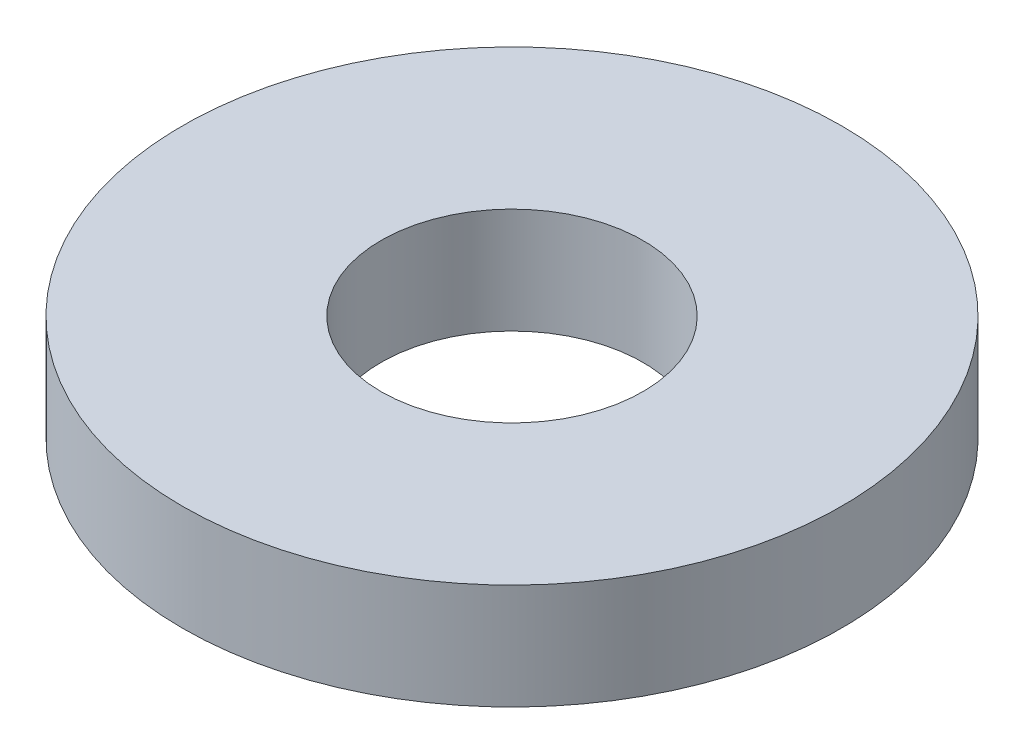
ISO-10303-21;
HEADER;
FILE_DESCRIPTION(('STEP AP214'),'2;1');
FILE_NAME('part.step','',(''),(''),'','','');
FILE_SCHEMA(('AUTOMOTIVE_DESIGN { 1 0 10303 214 1 1 1 1 }'));
ENDSEC;
DATA;
#1=APPLICATION_CONTEXT('core data for automotive mechanical design processes');
#2=APPLICATION_PROTOCOL_DEFINITION('international standard','automotive_design',2000,#1);
#3=PRODUCT_CONTEXT('',#1,'mechanical');
#4=PRODUCT('Part','Part','',(#3));
#5=PRODUCT_RELATED_PRODUCT_CATEGORY('part','',(#4));
#6=PRODUCT_DEFINITION_FORMATION('','',#4);
#7=PRODUCT_DEFINITION_CONTEXT('part definition',#1,'design');
#8=PRODUCT_DEFINITION('design','',#6,#7);
#9=PRODUCT_DEFINITION_SHAPE('','',#8);
#10=(LENGTH_UNIT() NAMED_UNIT(*) SI_UNIT(.MILLI.,.METRE.));
#11=(NAMED_UNIT(*) PLANE_ANGLE_UNIT() SI_UNIT($,.RADIAN.));
#12=(NAMED_UNIT(*) SI_UNIT($,.STERADIAN.) SOLID_ANGLE_UNIT());
#13=UNCERTAINTY_MEASURE_WITH_UNIT(LENGTH_MEASURE(1.E-05),#10,'distance_accuracy_value','');
#14=(GEOMETRIC_REPRESENTATION_CONTEXT(3) GLOBAL_UNCERTAINTY_ASSIGNED_CONTEXT((#13)) GLOBAL_UNIT_ASSIGNED_CONTEXT((#10,
#11,#12)) REPRESENTATION_CONTEXT('',''));
#15=CARTESIAN_POINT('',(0.,0.,0.));
#16=DIRECTION('',(0.,0.,1.));
#17=DIRECTION('',(1.,0.,0.));
#18=AXIS2_PLACEMENT_3D('',#15,#16,#17);
#19=CARTESIAN_POINT('',(0.,0.635,0.));
#20=DIRECTION('',(0.,1.,0.));
#21=DIRECTION('',(0.,0.,1.));
#22=AXIS2_PLACEMENT_3D('',#19,#20,#21);
#23=PLANE('',#22);
#24=CARTESIAN_POINT('',(0.,0.635,0.));
#25=DIRECTION('',(0.,1.,0.));
#26=DIRECTION('',(0.,0.,1.));
#27=AXIS2_PLACEMENT_3D('',#24,#25,#26);
#28=CIRCLE('',#27,1.9812);
#29=CARTESIAN_POINT('',(0.,0.635,1.9812));
#30=VERTEX_POINT('',#29);
#31=EDGE_CURVE('E10',#30,#30,#28,.T.);
#32=ORIENTED_EDGE('',*,*,#31,.T.);
#33=EDGE_LOOP('',(#32));
#34=FACE_BOUND('',#33,.T.);
#35=CARTESIAN_POINT('',(0.,0.635,0.));
#36=DIRECTION('',(0.,1.,0.));
#37=DIRECTION('',(0.,0.,1.));
#38=AXIS2_PLACEMENT_3D('',#35,#36,#37);
#39=CIRCLE('',#38,0.7874);
#40=CARTESIAN_POINT('',(0.,0.635,0.7874));
#41=VERTEX_POINT('',#40);
#42=EDGE_CURVE('E42',#41,#41,#39,.T.);
#43=ORIENTED_EDGE('',*,*,#42,.F.);
#44=EDGE_LOOP('',(#43));
#45=FACE_BOUND('',#44,.T.);
#46=ADVANCED_FACE('F31',(#34,#45),#23,.T.);
#47=CARTESIAN_POINT('',(0.,0.,0.));
#48=DIRECTION('',(0.,1.,0.));
#49=DIRECTION('',(0.,0.,1.));
#50=AXIS2_PLACEMENT_3D('',#47,#48,#49);
#51=PLANE('',#50);
#52=CARTESIAN_POINT('',(0.,0.,0.));
#53=DIRECTION('',(0.,1.,0.));
#54=DIRECTION('',(0.,0.,1.));
#55=AXIS2_PLACEMENT_3D('',#52,#53,#54);
#56=CIRCLE('',#55,1.9812);
#57=CARTESIAN_POINT('',(0.,0.,1.9812));
#58=VERTEX_POINT('',#57);
#59=EDGE_CURVE('E35',#58,#58,#56,.T.);
#60=ORIENTED_EDGE('',*,*,#59,.F.);
#61=EDGE_LOOP('',(#60));
#62=FACE_BOUND('',#61,.T.);
#63=CARTESIAN_POINT('',(0.,0.,0.));
#64=DIRECTION('',(0.,1.,0.));
#65=DIRECTION('',(0.,0.,1.));
#66=AXIS2_PLACEMENT_3D('',#63,#64,#65);
#67=CIRCLE('',#66,0.7874);
#68=CARTESIAN_POINT('',(0.,0.,0.7874));
#69=VERTEX_POINT('',#68);
#70=EDGE_CURVE('E44',#69,#69,#67,.T.);
#71=ORIENTED_EDGE('',*,*,#70,.T.);
#72=EDGE_LOOP('',(#71));
#73=FACE_BOUND('',#72,.T.);
#74=ADVANCED_FACE('F54',(#62,#73),#51,.F.);
#75=CARTESIAN_POINT('',(0.,0.635,0.));
#76=DIRECTION('',(0.,-1.,0.));
#77=DIRECTION('',(0.,0.,-1.));
#78=AXIS2_PLACEMENT_3D('',#75,#76,#77);
#79=CYLINDRICAL_SURFACE('',#78,1.9812);
#80=ORIENTED_EDGE('',*,*,#31,.F.);
#81=EDGE_LOOP('',(#80));
#82=FACE_BOUND('',#81,.T.);
#83=ORIENTED_EDGE('',*,*,#59,.T.);
#84=EDGE_LOOP('',(#83));
#85=FACE_BOUND('',#84,.T.);
#86=ADVANCED_FACE('F33',(#82,#85),#79,.T.);
#87=CARTESIAN_POINT('',(0.,0.635,0.));
#88=DIRECTION('',(0.,-1.,0.));
#89=DIRECTION('',(0.,0.,-1.));
#90=AXIS2_PLACEMENT_3D('',#87,#88,#89);
#91=CYLINDRICAL_SURFACE('',#90,0.7874);
#92=ORIENTED_EDGE('',*,*,#42,.T.);
#93=EDGE_LOOP('',(#92));
#94=FACE_BOUND('',#93,.T.);
#95=ORIENTED_EDGE('',*,*,#70,.F.);
#96=EDGE_LOOP('',(#95));
#97=FACE_BOUND('',#96,.T.);
#98=ADVANCED_FACE('F50',(#94,#97),#91,.F.);
#99=CLOSED_SHELL('',(#46,#74,#86,#98));
#100=MANIFOLD_SOLID_BREP('B2',#99);
#101=ADVANCED_BREP_SHAPE_REPRESENTATION('',(#18,#100),#14);
#102=SHAPE_DEFINITION_REPRESENTATION(#9,#101);
ENDSEC;
END-ISO-10303-21;
